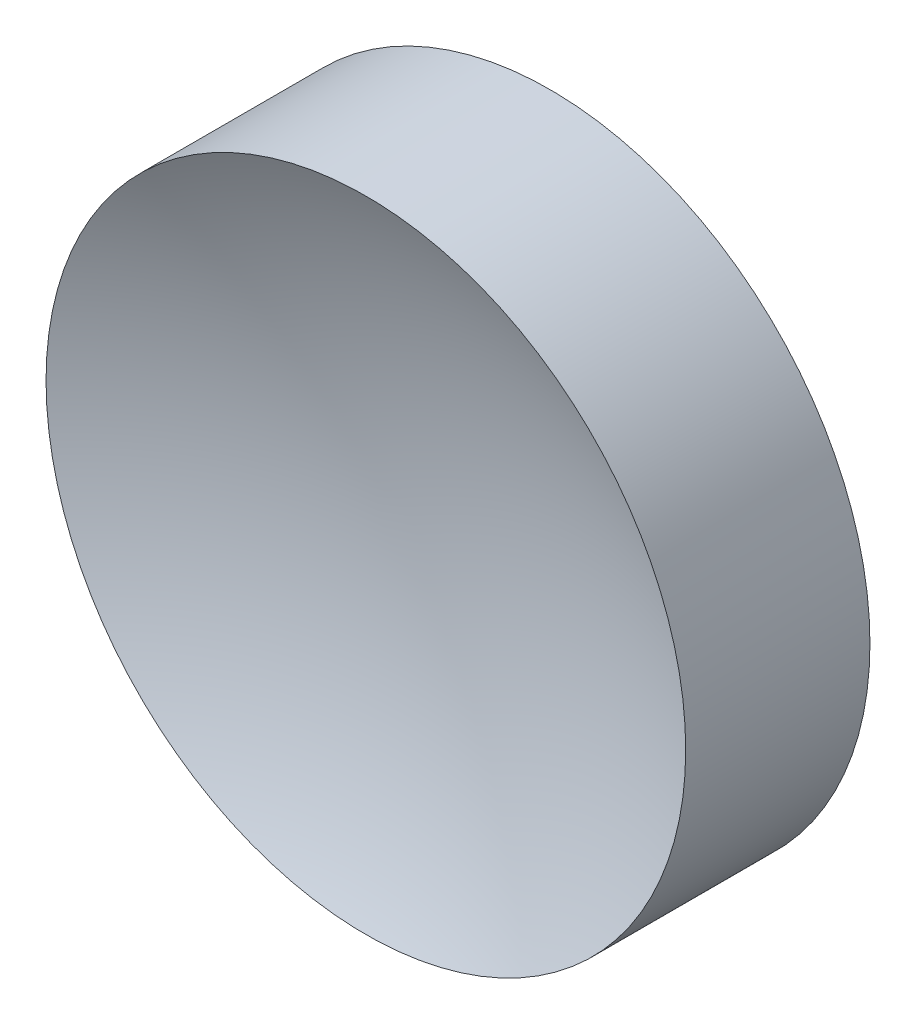
ISO-10303-21;
HEADER;
FILE_DESCRIPTION(('STEP AP214'),'2;1');
FILE_NAME('part.step','',(''),(''),'','','');
FILE_SCHEMA(('AUTOMOTIVE_DESIGN { 1 0 10303 214 1 1 1 1 }'));
ENDSEC;
DATA;
#1=APPLICATION_CONTEXT('core data for automotive mechanical design processes');
#2=APPLICATION_PROTOCOL_DEFINITION('international standard','automotive_design',2000,#1);
#3=PRODUCT_CONTEXT('',#1,'mechanical');
#4=PRODUCT('Part','Part','',(#3));
#5=PRODUCT_RELATED_PRODUCT_CATEGORY('part','',(#4));
#6=PRODUCT_DEFINITION_FORMATION('','',#4);
#7=PRODUCT_DEFINITION_CONTEXT('part definition',#1,'design');
#8=PRODUCT_DEFINITION('design','',#6,#7);
#9=PRODUCT_DEFINITION_SHAPE('','',#8);
#10=(LENGTH_UNIT() NAMED_UNIT(*) SI_UNIT(.MILLI.,.METRE.));
#11=(NAMED_UNIT(*) PLANE_ANGLE_UNIT() SI_UNIT($,.RADIAN.));
#12=(NAMED_UNIT(*) SI_UNIT($,.STERADIAN.) SOLID_ANGLE_UNIT());
#13=UNCERTAINTY_MEASURE_WITH_UNIT(LENGTH_MEASURE(1.E-05),#10,'distance_accuracy_value','');
#14=(GEOMETRIC_REPRESENTATION_CONTEXT(3) GLOBAL_UNCERTAINTY_ASSIGNED_CONTEXT((#13)) GLOBAL_UNIT_ASSIGNED_CONTEXT((#10,
#11,#12)) REPRESENTATION_CONTEXT('',''));
#15=CARTESIAN_POINT('',(0.,0.,0.));
#16=DIRECTION('',(0.,0.,1.));
#17=DIRECTION('',(1.,0.,0.));
#18=AXIS2_PLACEMENT_3D('',#15,#16,#17);
#19=CARTESIAN_POINT('',(0.,0.,27.5));
#20=DIRECTION('',(0.,0.,1.));
#21=DIRECTION('',(-1.,0.,0.));
#22=AXIS2_PLACEMENT_3D('',#19,#20,#21);
#23=SPHERICAL_SURFACE('',#22,27.5);
#24=CARTESIAN_POINT('',(0.,0.,2.75631393668276));
#25=DIRECTION('',(0.,0.,1.));
#26=DIRECTION('',(1.,0.,0.));
#27=AXIS2_PLACEMENT_3D('',#24,#25,#26);
#28=CIRCLE('',#27,12.);
#29=CARTESIAN_POINT('',(12.,0.,2.75631393668275));
#30=VERTEX_POINT('',#29);
#31=EDGE_CURVE('E43',#30,#30,#28,.T.);
#32=ORIENTED_EDGE('',*,*,#31,.T.);
#33=EDGE_LOOP('',(#32));
#34=FACE_BOUND('',#33,.T.);
#35=ADVANCED_FACE('F37',(#34),#23,.F.);
#36=CARTESIAN_POINT('',(0.,0.,-28.9));
#37=DIRECTION('',(0.,0.,1.));
#38=DIRECTION('',(1.,0.,0.));
#39=AXIS2_PLACEMENT_3D('',#36,#37,#38);
#40=SPHERICAL_SURFACE('',#39,27.5);
#41=CARTESIAN_POINT('',(0.,0.,-4.15631393668276));
#42=DIRECTION('',(0.,0.,1.));
#43=DIRECTION('',(1.,0.,0.));
#44=AXIS2_PLACEMENT_3D('',#41,#42,#43);
#45=CIRCLE('',#44,12.);
#46=CARTESIAN_POINT('',(12.,0.,-4.15631393668276));
#47=VERTEX_POINT('',#46);
#48=EDGE_CURVE('E10',#47,#47,#45,.T.);
#49=ORIENTED_EDGE('',*,*,#48,.F.);
#50=EDGE_LOOP('',(#49));
#51=FACE_BOUND('',#50,.T.);
#52=ADVANCED_FACE('F52',(#51),#40,.F.);
#53=CARTESIAN_POINT('',(0.,0.,0.));
#54=DIRECTION('',(0.,0.,1.));
#55=DIRECTION('',(1.,0.,0.));
#56=AXIS2_PLACEMENT_3D('',#53,#54,#55);
#57=CYLINDRICAL_SURFACE('',#56,12.);
#58=ORIENTED_EDGE('',*,*,#31,.F.);
#59=EDGE_LOOP('',(#58));
#60=FACE_BOUND('',#59,.T.);
#61=ORIENTED_EDGE('',*,*,#48,.T.);
#62=EDGE_LOOP('',(#61));
#63=FACE_BOUND('',#62,.T.);
#64=ADVANCED_FACE('F50',(#60,#63),#57,.T.);
#65=CLOSED_SHELL('',(#35,#52,#64));
#66=MANIFOLD_SOLID_BREP('B2',#65);
#67=ADVANCED_BREP_SHAPE_REPRESENTATION('',(#18,#66),#14);
#68=SHAPE_DEFINITION_REPRESENTATION(#9,#67);
ENDSEC;
END-ISO-10303-21;
